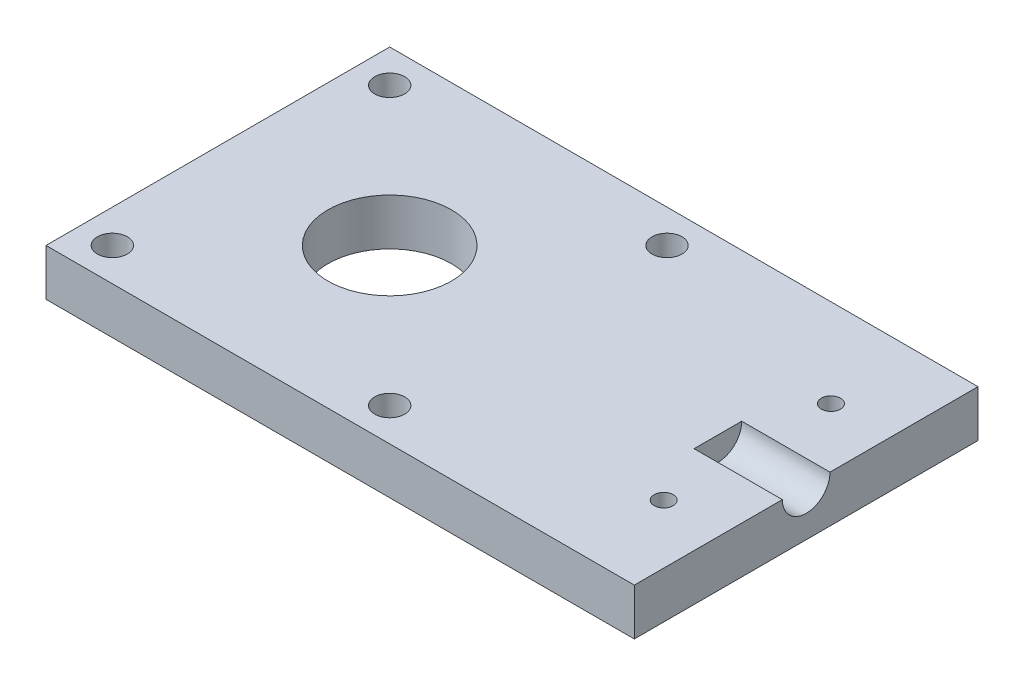
ISO-10303-21;
HEADER;
FILE_DESCRIPTION(('STEP AP214'),'2;1');
FILE_NAME('part.step','',(''),(''),'','','');
FILE_SCHEMA(('AUTOMOTIVE_DESIGN { 1 0 10303 214 1 1 1 1 }'));
ENDSEC;
DATA;
#1=APPLICATION_CONTEXT('core data for automotive mechanical design processes');
#2=APPLICATION_PROTOCOL_DEFINITION('international standard','automotive_design',2000,#1);
#3=PRODUCT_CONTEXT('',#1,'mechanical');
#4=PRODUCT('Part','Part','',(#3));
#5=PRODUCT_RELATED_PRODUCT_CATEGORY('part','',(#4));
#6=PRODUCT_DEFINITION_FORMATION('','',#4);
#7=PRODUCT_DEFINITION_CONTEXT('part definition',#1,'design');
#8=PRODUCT_DEFINITION('design','',#6,#7);
#9=PRODUCT_DEFINITION_SHAPE('','',#8);
#10=(LENGTH_UNIT() NAMED_UNIT(*) SI_UNIT(.MILLI.,.METRE.));
#11=(NAMED_UNIT(*) PLANE_ANGLE_UNIT() SI_UNIT($,.RADIAN.));
#12=(NAMED_UNIT(*) SI_UNIT($,.STERADIAN.) SOLID_ANGLE_UNIT());
#13=UNCERTAINTY_MEASURE_WITH_UNIT(LENGTH_MEASURE(1.E-05),#10,'distance_accuracy_value','');
#14=(GEOMETRIC_REPRESENTATION_CONTEXT(3) GLOBAL_UNCERTAINTY_ASSIGNED_CONTEXT((#13)) GLOBAL_UNIT_ASSIGNED_CONTEXT((#10,
#11,#12)) REPRESENTATION_CONTEXT('',''));
#15=CARTESIAN_POINT('',(0.,0.,0.));
#16=DIRECTION('',(0.,0.,1.));
#17=DIRECTION('',(1.,0.,0.));
#18=AXIS2_PLACEMENT_3D('',#15,#16,#17);
#19=CARTESIAN_POINT('',(0.,-118.006174647806,0.));
#20=DIRECTION('',(0.,-1.,0.));
#21=DIRECTION('',(0.,0.,-1.));
#22=AXIS2_PLACEMENT_3D('',#19,#20,#21);
#23=PLANE('',#22);
#24=CARTESIAN_POINT('',(85.5067485860885,-118.006174647806,57.3991119079618));
#25=DIRECTION('',(0.,-1.,0.));
#26=DIRECTION('',(0.,0.,-1.));
#27=AXIS2_PLACEMENT_3D('',#24,#25,#26);
#28=CIRCLE('',#27,1.625);
#29=CARTESIAN_POINT('',(85.5067485860885,-118.006174647806,55.7741119079618));
#30=VERTEX_POINT('',#29);
#31=EDGE_CURVE('E134',#30,#30,#28,.T.);
#32=ORIENTED_EDGE('',*,*,#31,.F.);
#33=EDGE_LOOP('',(#32));
#34=FACE_BOUND('',#33,.T.);
#35=CARTESIAN_POINT('',(48.2867485860888,-118.006174647806,95.1791119079618));
#36=DIRECTION('',(0.,-1.,0.));
#37=DIRECTION('',(0.,0.,-1.));
#38=AXIS2_PLACEMENT_3D('',#35,#36,#37);
#39=CIRCLE('',#38,2.55);
#40=CARTESIAN_POINT('',(48.2867485860888,-118.006174647806,92.6291119079618));
#41=VERTEX_POINT('',#40);
#42=EDGE_CURVE('E146',#41,#41,#39,.T.);
#43=ORIENTED_EDGE('',*,*,#42,.F.);
#44=EDGE_LOOP('',(#43));
#45=FACE_BOUND('',#44,.T.);
#46=CARTESIAN_POINT('',(1.14674858608876,-118.006174647806,95.1791119079618));
#47=DIRECTION('',(0.,-1.,0.));
#48=DIRECTION('',(0.,0.,-1.));
#49=AXIS2_PLACEMENT_3D('',#46,#47,#48);
#50=CIRCLE('',#49,2.55);
#51=CARTESIAN_POINT('',(1.14674858608876,-118.006174647806,92.6291119079618));
#52=VERTEX_POINT('',#51);
#53=EDGE_CURVE('E158',#52,#52,#50,.T.);
#54=ORIENTED_EDGE('',*,*,#53,.F.);
#55=EDGE_LOOP('',(#54));
#56=FACE_BOUND('',#55,.T.);
#57=DIRECTION('',(0.,0.,-1.));
#58=VECTOR('',#57,1.);
#59=CARTESIAN_POINT('',(-4.49325141391123,-118.006174647806,100.819111907962));
#60=LINE('',#59,#58);
#61=CARTESIAN_POINT('',(-4.49325141391123,-118.006174647806,100.819111907962));
#62=VERTEX_POINT('',#61);
#63=CARTESIAN_POINT('',(-4.49325141391123,-118.006174647806,42.3991119079618));
#64=VERTEX_POINT('',#63);
#65=EDGE_CURVE('E170',#62,#64,#60,.T.);
#66=ORIENTED_EDGE('',*,*,#65,.T.);
#67=DIRECTION('',(1.,0.,0.));
#68=VECTOR('',#67,1.);
#69=CARTESIAN_POINT('',(-4.49325141391123,-118.006174647806,42.3991119079618));
#70=LINE('',#69,#68);
#71=CARTESIAN_POINT('',(95.5067485860888,-118.006174647806,42.3991119079618));
#72=VERTEX_POINT('',#71);
#73=EDGE_CURVE('E101',#64,#72,#70,.T.);
#74=ORIENTED_EDGE('',*,*,#73,.T.);
#75=DIRECTION('',(0.,0.,1.));
#76=VECTOR('',#75,1.);
#77=CARTESIAN_POINT('',(95.5067485860888,-118.006174647806,100.819111907962));
#78=LINE('',#77,#76);
#79=CARTESIAN_POINT('',(95.5067485860888,-118.006174647806,100.819111907962));
#80=VERTEX_POINT('',#79);
#81=EDGE_CURVE('E173',#72,#80,#78,.T.);
#82=ORIENTED_EDGE('',*,*,#81,.T.);
#83=DIRECTION('',(-1.,0.,0.));
#84=VECTOR('',#83,1.);
#85=CARTESIAN_POINT('',(-4.49325141391123,-118.006174647806,100.819111907962));
#86=LINE('',#85,#84);
#87=EDGE_CURVE('E72',#80,#62,#86,.T.);
#88=ORIENTED_EDGE('',*,*,#87,.T.);
#89=EDGE_LOOP('',(#66,#74,#82,#88));
#90=FACE_BOUND('',#89,.T.);
#91=CARTESIAN_POINT('',(1.14674858608876,-118.006174647806,48.0391119079618));
#92=DIRECTION('',(0.,-1.,0.));
#93=DIRECTION('',(0.,0.,-1.));
#94=AXIS2_PLACEMENT_3D('',#91,#92,#93);
#95=CIRCLE('',#94,2.55);
#96=CARTESIAN_POINT('',(1.14674858608876,-118.006174647806,45.4891119079617));
#97=VERTEX_POINT('',#96);
#98=EDGE_CURVE('E164',#97,#97,#95,.T.);
#99=ORIENTED_EDGE('',*,*,#98,.F.);
#100=EDGE_LOOP('',(#99));
#101=FACE_BOUND('',#100,.T.);
#102=CARTESIAN_POINT('',(48.2867485860888,-118.006174647806,48.0391119079618));
#103=DIRECTION('',(0.,-1.,0.));
#104=DIRECTION('',(0.,0.,-1.));
#105=AXIS2_PLACEMENT_3D('',#102,#103,#104);
#106=CIRCLE('',#105,2.55);
#107=CARTESIAN_POINT('',(48.2867485860888,-118.006174647806,45.4891119079618));
#108=VERTEX_POINT('',#107);
#109=EDGE_CURVE('E152',#108,#108,#106,.T.);
#110=ORIENTED_EDGE('',*,*,#109,.F.);
#111=EDGE_LOOP('',(#110));
#112=FACE_BOUND('',#111,.T.);
#113=CARTESIAN_POINT('',(85.5067485860885,-118.006174647806,85.8191119079618));
#114=DIRECTION('',(0.,-1.,0.));
#115=DIRECTION('',(0.,0.,-1.));
#116=AXIS2_PLACEMENT_3D('',#113,#114,#115);
#117=CIRCLE('',#116,1.625);
#118=CARTESIAN_POINT('',(85.5067485860885,-118.006174647806,84.1941119079618));
#119=VERTEX_POINT('',#118);
#120=EDGE_CURVE('E140',#119,#119,#117,.T.);
#121=ORIENTED_EDGE('',*,*,#120,.F.);
#122=EDGE_LOOP('',(#121));
#123=FACE_BOUND('',#122,.T.);
#124=CARTESIAN_POINT('',(24.7167485860888,-118.006174647806,71.6091119079617));
#125=DIRECTION('',(0.,-1.,0.));
#126=DIRECTION('',(0.,0.,-1.));
#127=AXIS2_PLACEMENT_3D('',#124,#125,#126);
#128=CIRCLE('',#127,10.5);
#129=CARTESIAN_POINT('',(24.7167485860888,-118.006174647806,61.1091119079618));
#130=VERTEX_POINT('',#129);
#131=EDGE_CURVE('E128',#130,#130,#128,.T.);
#132=ORIENTED_EDGE('',*,*,#131,.F.);
#133=EDGE_LOOP('',(#132));
#134=FACE_BOUND('',#133,.T.);
#135=ADVANCED_FACE('F48',(#34,#45,#56,#90,#101,#112,#123,#134),#23,.T.);
#136=CARTESIAN_POINT('',(0.,-110.068674647806,0.));
#137=DIRECTION('',(0.,-1.,0.));
#138=DIRECTION('',(0.,0.,-1.));
#139=AXIS2_PLACEMENT_3D('',#136,#137,#138);
#140=PLANE('',#139);
#141=DIRECTION('',(0.,0.,1.));
#142=VECTOR('',#141,1.);
#143=CARTESIAN_POINT('',(80.5067485860888,-110.068674647806,0.));
#144=LINE('',#143,#142);
#145=CARTESIAN_POINT('',(80.5067485860888,-110.068674647806,67.5591119079618));
#146=VERTEX_POINT('',#145);
#147=CARTESIAN_POINT('',(80.5067485860888,-110.068674647806,75.6591119079618));
#148=VERTEX_POINT('',#147);
#149=EDGE_CURVE('E13',#146,#148,#144,.T.);
#150=ORIENTED_EDGE('',*,*,#149,.F.);
#151=DIRECTION('',(1.,0.,0.));
#152=VECTOR('',#151,1.);
#153=CARTESIAN_POINT('',(80.5067485860888,-110.068674647806,67.5591119079618));
#154=LINE('',#153,#152);
#155=CARTESIAN_POINT('',(95.5067485860888,-110.068674647806,67.5591119079618));
#156=VERTEX_POINT('',#155);
#157=EDGE_CURVE('E109',#146,#156,#154,.T.);
#158=ORIENTED_EDGE('',*,*,#157,.T.);
#159=DIRECTION('',(0.,0.,1.));
#160=VECTOR('',#159,1.);
#161=CARTESIAN_POINT('',(95.5067485860888,-110.068674647806,100.819111907962));
#162=LINE('',#161,#160);
#163=CARTESIAN_POINT('',(95.5067485860888,-110.068674647806,42.3991119079618));
#164=VERTEX_POINT('',#163);
#165=EDGE_CURVE('E181',#164,#156,#162,.T.);
#166=ORIENTED_EDGE('',*,*,#165,.F.);
#167=DIRECTION('',(1.,0.,0.));
#168=VECTOR('',#167,1.);
#169=CARTESIAN_POINT('',(-4.49325141391123,-110.068674647806,42.3991119079618));
#170=LINE('',#169,#168);
#171=CARTESIAN_POINT('',(-4.49325141391123,-110.068674647806,42.3991119079618));
#172=VERTEX_POINT('',#171);
#173=EDGE_CURVE('E179',#172,#164,#170,.T.);
#174=ORIENTED_EDGE('',*,*,#173,.F.);
#175=DIRECTION('',(0.,0.,-1.));
#176=VECTOR('',#175,1.);
#177=CARTESIAN_POINT('',(-4.49325141391123,-110.068674647806,100.819111907962));
#178=LINE('',#177,#176);
#179=CARTESIAN_POINT('',(-4.49325141391123,-110.068674647806,100.819111907962));
#180=VERTEX_POINT('',#179);
#181=EDGE_CURVE('E167',#180,#172,#178,.T.);
#182=ORIENTED_EDGE('',*,*,#181,.F.);
#183=DIRECTION('',(-1.,0.,0.));
#184=VECTOR('',#183,1.);
#185=CARTESIAN_POINT('',(-4.49325141391123,-110.068674647806,100.819111907962));
#186=LINE('',#185,#184);
#187=CARTESIAN_POINT('',(95.5067485860888,-110.068674647806,100.819111907962));
#188=VERTEX_POINT('',#187);
#189=EDGE_CURVE('E93',#188,#180,#186,.T.);
#190=ORIENTED_EDGE('',*,*,#189,.F.);
#191=CARTESIAN_POINT('',(95.5067485860888,-110.068674647806,75.6591119079618));
#192=VERTEX_POINT('',#191);
#193=EDGE_CURVE('E125',#192,#188,#162,.T.);
#194=ORIENTED_EDGE('',*,*,#193,.F.);
#195=DIRECTION('',(1.,0.,0.));
#196=VECTOR('',#195,1.);
#197=CARTESIAN_POINT('',(80.5067485860888,-110.068674647806,75.6591119079618));
#198=LINE('',#197,#196);
#199=EDGE_CURVE('E63',#192,#148,#198,.F.);
#200=ORIENTED_EDGE('',*,*,#199,.T.);
#201=EDGE_LOOP('',(#150,#158,#166,#174,#182,#190,#194,#200));
#202=FACE_BOUND('',#201,.T.);
#203=CARTESIAN_POINT('',(1.14674858608876,-110.068674647806,48.0391119079618));
#204=DIRECTION('',(0.,-1.,0.));
#205=DIRECTION('',(0.,0.,-1.));
#206=AXIS2_PLACEMENT_3D('',#203,#204,#205);
#207=CIRCLE('',#206,2.55);
#208=CARTESIAN_POINT('',(1.14674858608876,-110.068674647806,45.4891119079617));
#209=VERTEX_POINT('',#208);
#210=EDGE_CURVE('E161',#209,#209,#207,.T.);
#211=ORIENTED_EDGE('',*,*,#210,.T.);
#212=EDGE_LOOP('',(#211));
#213=FACE_BOUND('',#212,.T.);
#214=CARTESIAN_POINT('',(1.14674858608876,-110.068674647806,95.1791119079618));
#215=DIRECTION('',(0.,-1.,0.));
#216=DIRECTION('',(0.,0.,-1.));
#217=AXIS2_PLACEMENT_3D('',#214,#215,#216);
#218=CIRCLE('',#217,2.55);
#219=CARTESIAN_POINT('',(1.14674858608876,-110.068674647806,92.6291119079618));
#220=VERTEX_POINT('',#219);
#221=EDGE_CURVE('E155',#220,#220,#218,.T.);
#222=ORIENTED_EDGE('',*,*,#221,.T.);
#223=EDGE_LOOP('',(#222));
#224=FACE_BOUND('',#223,.T.);
#225=CARTESIAN_POINT('',(48.2867485860888,-110.068674647806,48.0391119079618));
#226=DIRECTION('',(0.,-1.,0.));
#227=DIRECTION('',(0.,0.,-1.));
#228=AXIS2_PLACEMENT_3D('',#225,#226,#227);
#229=CIRCLE('',#228,2.55);
#230=CARTESIAN_POINT('',(48.2867485860888,-110.068674647806,45.4891119079618));
#231=VERTEX_POINT('',#230);
#232=EDGE_CURVE('E149',#231,#231,#229,.T.);
#233=ORIENTED_EDGE('',*,*,#232,.T.);
#234=EDGE_LOOP('',(#233));
#235=FACE_BOUND('',#234,.T.);
#236=CARTESIAN_POINT('',(48.2867485860888,-110.068674647806,95.1791119079618));
#237=DIRECTION('',(0.,-1.,0.));
#238=DIRECTION('',(0.,0.,-1.));
#239=AXIS2_PLACEMENT_3D('',#236,#237,#238);
#240=CIRCLE('',#239,2.55);
#241=CARTESIAN_POINT('',(48.2867485860888,-110.068674647806,92.6291119079618));
#242=VERTEX_POINT('',#241);
#243=EDGE_CURVE('E143',#242,#242,#240,.T.);
#244=ORIENTED_EDGE('',*,*,#243,.T.);
#245=EDGE_LOOP('',(#244));
#246=FACE_BOUND('',#245,.T.);
#247=CARTESIAN_POINT('',(85.5067485860885,-110.068674647806,85.8191119079618));
#248=DIRECTION('',(0.,-1.,0.));
#249=DIRECTION('',(0.,0.,-1.));
#250=AXIS2_PLACEMENT_3D('',#247,#248,#249);
#251=CIRCLE('',#250,1.625);
#252=CARTESIAN_POINT('',(85.5067485860885,-110.068674647806,84.1941119079618));
#253=VERTEX_POINT('',#252);
#254=EDGE_CURVE('E137',#253,#253,#251,.T.);
#255=ORIENTED_EDGE('',*,*,#254,.T.);
#256=EDGE_LOOP('',(#255));
#257=FACE_BOUND('',#256,.T.);
#258=CARTESIAN_POINT('',(85.5067485860885,-110.068674647806,57.3991119079618));
#259=DIRECTION('',(0.,-1.,0.));
#260=DIRECTION('',(0.,0.,-1.));
#261=AXIS2_PLACEMENT_3D('',#258,#259,#260);
#262=CIRCLE('',#261,1.625);
#263=CARTESIAN_POINT('',(85.5067485860885,-110.068674647806,55.7741119079618));
#264=VERTEX_POINT('',#263);
#265=EDGE_CURVE('E131',#264,#264,#262,.T.);
#266=ORIENTED_EDGE('',*,*,#265,.T.);
#267=EDGE_LOOP('',(#266));
#268=FACE_BOUND('',#267,.T.);
#269=CARTESIAN_POINT('',(24.7167485860888,-110.068674647806,71.6091119079617));
#270=DIRECTION('',(0.,-1.,0.));
#271=DIRECTION('',(0.,0.,-1.));
#272=AXIS2_PLACEMENT_3D('',#269,#270,#271);
#273=CIRCLE('',#272,10.5);
#274=CARTESIAN_POINT('',(24.7167485860888,-110.068674647806,61.1091119079618));
#275=VERTEX_POINT('',#274);
#276=EDGE_CURVE('E117',#275,#275,#273,.T.);
#277=ORIENTED_EDGE('',*,*,#276,.T.);
#278=EDGE_LOOP('',(#277));
#279=FACE_BOUND('',#278,.T.);
#280=ADVANCED_FACE('F122',(#202,#213,#224,#235,#246,#257,#268,#279),#140,.F.);
#281=CARTESIAN_POINT('',(-4.49325141391123,-118.006174647806,100.819111907962));
#282=DIRECTION('',(1.,0.,0.));
#283=DIRECTION('',(0.,0.,-1.));
#284=AXIS2_PLACEMENT_3D('',#281,#282,#283);
#285=PLANE('',#284);
#286=ORIENTED_EDGE('',*,*,#181,.T.);
#287=DIRECTION('',(0.,1.,0.));
#288=VECTOR('',#287,1.);
#289=CARTESIAN_POINT('',(-4.49325141391123,-118.006174647806,42.3991119079618));
#290=LINE('',#289,#288);
#291=EDGE_CURVE('E190',#64,#172,#290,.T.);
#292=ORIENTED_EDGE('',*,*,#291,.F.);
#293=ORIENTED_EDGE('',*,*,#65,.F.);
#294=DIRECTION('',(0.,1.,0.));
#295=VECTOR('',#294,1.);
#296=CARTESIAN_POINT('',(-4.49325141391123,-118.006174647806,100.819111907962));
#297=LINE('',#296,#295);
#298=EDGE_CURVE('E176',#62,#180,#297,.T.);
#299=ORIENTED_EDGE('',*,*,#298,.T.);
#300=EDGE_LOOP('',(#286,#292,#293,#299));
#301=FACE_BOUND('',#300,.T.);
#302=ADVANCED_FACE('F50',(#301),#285,.F.);
#303=CARTESIAN_POINT('',(-4.49325141391123,-118.006174647806,42.3991119079618));
#304=DIRECTION('',(0.,0.,1.));
#305=DIRECTION('',(1.,0.,0.));
#306=AXIS2_PLACEMENT_3D('',#303,#304,#305);
#307=PLANE('',#306);
#308=ORIENTED_EDGE('',*,*,#173,.T.);
#309=DIRECTION('',(0.,1.,0.));
#310=VECTOR('',#309,1.);
#311=CARTESIAN_POINT('',(95.5067485860888,-118.006174647806,42.3991119079618));
#312=LINE('',#311,#310);
#313=EDGE_CURVE('E187',#72,#164,#312,.T.);
#314=ORIENTED_EDGE('',*,*,#313,.F.);
#315=ORIENTED_EDGE('',*,*,#73,.F.);
#316=ORIENTED_EDGE('',*,*,#291,.T.);
#317=EDGE_LOOP('',(#308,#314,#315,#316));
#318=FACE_BOUND('',#317,.T.);
#319=ADVANCED_FACE('F197',(#318),#307,.F.);
#320=CARTESIAN_POINT('',(95.5067485860888,-118.006174647806,100.819111907962));
#321=DIRECTION('',(-1.,0.,0.));
#322=DIRECTION('',(0.,0.,1.));
#323=AXIS2_PLACEMENT_3D('',#320,#321,#322);
#324=PLANE('',#323);
#325=ORIENTED_EDGE('',*,*,#165,.T.);
#326=CARTESIAN_POINT('',(95.5067485860888,-110.068674647806,71.6091119079618));
#327=DIRECTION('',(-1.,0.,0.));
#328=DIRECTION('',(0.,0.,1.));
#329=AXIS2_PLACEMENT_3D('',#326,#327,#328);
#330=CIRCLE('',#329,4.05);
#331=EDGE_CURVE('E56',#156,#192,#330,.T.);
#332=ORIENTED_EDGE('',*,*,#331,.T.);
#333=ORIENTED_EDGE('',*,*,#193,.T.);
#334=DIRECTION('',(0.,1.,0.));
#335=VECTOR('',#334,1.);
#336=CARTESIAN_POINT('',(95.5067485860888,-118.006174647806,100.819111907962));
#337=LINE('',#336,#335);
#338=EDGE_CURVE('E185',#80,#188,#337,.T.);
#339=ORIENTED_EDGE('',*,*,#338,.F.);
#340=ORIENTED_EDGE('',*,*,#81,.F.);
#341=ORIENTED_EDGE('',*,*,#313,.T.);
#342=EDGE_LOOP('',(#325,#332,#333,#339,#340,#341));
#343=FACE_BOUND('',#342,.T.);
#344=ADVANCED_FACE('F192',(#343),#324,.F.);
#345=CARTESIAN_POINT('',(-4.49325141391123,-118.006174647806,100.819111907962));
#346=DIRECTION('',(0.,0.,-1.));
#347=DIRECTION('',(-1.,0.,0.));
#348=AXIS2_PLACEMENT_3D('',#345,#346,#347);
#349=PLANE('',#348);
#350=ORIENTED_EDGE('',*,*,#189,.T.);
#351=ORIENTED_EDGE('',*,*,#298,.F.);
#352=ORIENTED_EDGE('',*,*,#87,.F.);
#353=ORIENTED_EDGE('',*,*,#338,.T.);
#354=EDGE_LOOP('',(#350,#351,#352,#353));
#355=FACE_BOUND('',#354,.T.);
#356=ADVANCED_FACE('F200',(#355),#349,.F.);
#357=CARTESIAN_POINT('',(1.14674858608876,-118.006174647806,48.0391119079618));
#358=DIRECTION('',(0.,1.,0.));
#359=DIRECTION('',(0.,0.,1.));
#360=AXIS2_PLACEMENT_3D('',#357,#358,#359);
#361=CYLINDRICAL_SURFACE('',#360,2.55);
#362=ORIENTED_EDGE('',*,*,#98,.T.);
#363=EDGE_LOOP('',(#362));
#364=FACE_BOUND('',#363,.T.);
#365=ORIENTED_EDGE('',*,*,#210,.F.);
#366=EDGE_LOOP('',(#365));
#367=FACE_BOUND('',#366,.T.);
#368=ADVANCED_FACE('F229',(#364,#367),#361,.F.);
#369=CARTESIAN_POINT('',(1.14674858608876,-118.006174647806,95.1791119079618));
#370=DIRECTION('',(0.,1.,0.));
#371=DIRECTION('',(0.,0.,1.));
#372=AXIS2_PLACEMENT_3D('',#369,#370,#371);
#373=CYLINDRICAL_SURFACE('',#372,2.55);
#374=ORIENTED_EDGE('',*,*,#53,.T.);
#375=EDGE_LOOP('',(#374));
#376=FACE_BOUND('',#375,.T.);
#377=ORIENTED_EDGE('',*,*,#221,.F.);
#378=EDGE_LOOP('',(#377));
#379=FACE_BOUND('',#378,.T.);
#380=ADVANCED_FACE('F250',(#376,#379),#373,.F.);
#381=CARTESIAN_POINT('',(48.2867485860888,-118.006174647806,48.0391119079618));
#382=DIRECTION('',(0.,1.,0.));
#383=DIRECTION('',(0.,0.,1.));
#384=AXIS2_PLACEMENT_3D('',#381,#382,#383);
#385=CYLINDRICAL_SURFACE('',#384,2.55);
#386=ORIENTED_EDGE('',*,*,#109,.T.);
#387=EDGE_LOOP('',(#386));
#388=FACE_BOUND('',#387,.T.);
#389=ORIENTED_EDGE('',*,*,#232,.F.);
#390=EDGE_LOOP('',(#389));
#391=FACE_BOUND('',#390,.T.);
#392=ADVANCED_FACE('F257',(#388,#391),#385,.F.);
#393=CARTESIAN_POINT('',(48.2867485860888,-118.006174647806,95.1791119079618));
#394=DIRECTION('',(0.,1.,0.));
#395=DIRECTION('',(0.,0.,1.));
#396=AXIS2_PLACEMENT_3D('',#393,#394,#395);
#397=CYLINDRICAL_SURFACE('',#396,2.55);
#398=ORIENTED_EDGE('',*,*,#42,.T.);
#399=EDGE_LOOP('',(#398));
#400=FACE_BOUND('',#399,.T.);
#401=ORIENTED_EDGE('',*,*,#243,.F.);
#402=EDGE_LOOP('',(#401));
#403=FACE_BOUND('',#402,.T.);
#404=ADVANCED_FACE('F265',(#400,#403),#397,.F.);
#405=CARTESIAN_POINT('',(85.5067485860885,-118.006174647806,85.8191119079618));
#406=DIRECTION('',(0.,1.,0.));
#407=DIRECTION('',(0.,0.,1.));
#408=AXIS2_PLACEMENT_3D('',#405,#406,#407);
#409=CYLINDRICAL_SURFACE('',#408,1.625);
#410=ORIENTED_EDGE('',*,*,#120,.T.);
#411=EDGE_LOOP('',(#410));
#412=FACE_BOUND('',#411,.T.);
#413=ORIENTED_EDGE('',*,*,#254,.F.);
#414=EDGE_LOOP('',(#413));
#415=FACE_BOUND('',#414,.T.);
#416=ADVANCED_FACE('F273',(#412,#415),#409,.F.);
#417=CARTESIAN_POINT('',(85.5067485860885,-118.006174647806,57.3991119079618));
#418=DIRECTION('',(0.,1.,0.));
#419=DIRECTION('',(0.,0.,1.));
#420=AXIS2_PLACEMENT_3D('',#417,#418,#419);
#421=CYLINDRICAL_SURFACE('',#420,1.625);
#422=ORIENTED_EDGE('',*,*,#31,.T.);
#423=EDGE_LOOP('',(#422));
#424=FACE_BOUND('',#423,.T.);
#425=ORIENTED_EDGE('',*,*,#265,.F.);
#426=EDGE_LOOP('',(#425));
#427=FACE_BOUND('',#426,.T.);
#428=ADVANCED_FACE('F216',(#424,#427),#421,.F.);
#429=CARTESIAN_POINT('',(24.7167485860888,-118.006174647806,71.6091119079617));
#430=DIRECTION('',(0.,1.,0.));
#431=DIRECTION('',(0.,0.,1.));
#432=AXIS2_PLACEMENT_3D('',#429,#430,#431);
#433=CYLINDRICAL_SURFACE('',#432,10.5);
#434=ORIENTED_EDGE('',*,*,#131,.T.);
#435=EDGE_LOOP('',(#434));
#436=FACE_BOUND('',#435,.T.);
#437=ORIENTED_EDGE('',*,*,#276,.F.);
#438=EDGE_LOOP('',(#437));
#439=FACE_BOUND('',#438,.T.);
#440=ADVANCED_FACE('F213',(#436,#439),#433,.F.);
#441=CARTESIAN_POINT('',(80.5067485860888,-110.068674647806,71.6091119079618));
#442=DIRECTION('',(1.,0.,0.));
#443=DIRECTION('',(0.,0.,-1.));
#444=AXIS2_PLACEMENT_3D('',#441,#442,#443);
#445=PLANE('',#444);
#446=ORIENTED_EDGE('',*,*,#149,.T.);
#447=CARTESIAN_POINT('',(80.5067485860888,-110.068674647806,71.6091119079618));
#448=DIRECTION('',(1.,0.,0.));
#449=DIRECTION('',(0.,0.,-1.));
#450=AXIS2_PLACEMENT_3D('',#447,#448,#449);
#451=CIRCLE('',#450,4.05);
#452=EDGE_CURVE('E112',#148,#146,#451,.T.);
#453=ORIENTED_EDGE('',*,*,#452,.T.);
#454=EDGE_LOOP('',(#446,#453));
#455=FACE_BOUND('',#454,.T.);
#456=ADVANCED_FACE('F120',(#455),#445,.T.);
#457=CARTESIAN_POINT('',(80.5067485860888,-110.068674647806,71.6091119079618));
#458=DIRECTION('',(1.,0.,0.));
#459=DIRECTION('',(0.,0.,-1.));
#460=AXIS2_PLACEMENT_3D('',#457,#458,#459);
#461=CYLINDRICAL_SURFACE('',#460,4.05);
#462=ORIENTED_EDGE('',*,*,#452,.F.);
#463=ORIENTED_EDGE('',*,*,#199,.F.);
#464=ORIENTED_EDGE('',*,*,#331,.F.);
#465=ORIENTED_EDGE('',*,*,#157,.F.);
#466=EDGE_LOOP('',(#462,#463,#464,#465));
#467=FACE_BOUND('',#466,.T.);
#468=ADVANCED_FACE('F111',(#467),#461,.F.);
#469=CLOSED_SHELL('',(#135,#280,#302,#319,#344,#356,#368,#380,#392,#404,#416,#428,#440,#456,#468));
#470=MANIFOLD_SOLID_BREP('B2',#469);
#471=ADVANCED_BREP_SHAPE_REPRESENTATION('',(#18,#470),#14);
#472=SHAPE_DEFINITION_REPRESENTATION(#9,#471);
ENDSEC;
END-ISO-10303-21;
